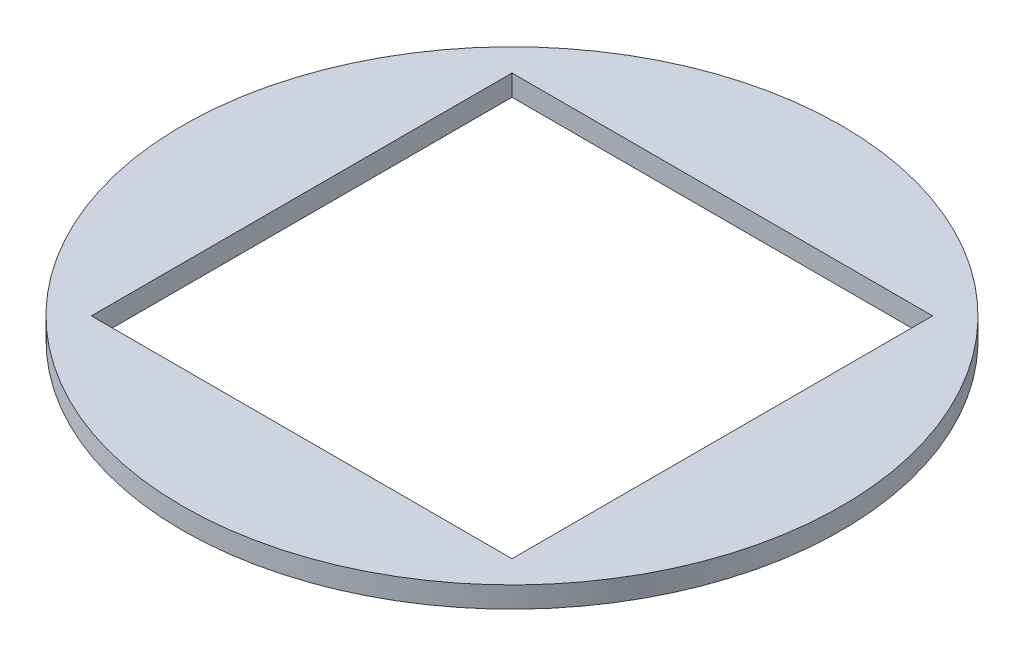
ISO-10303-21;
HEADER;
FILE_DESCRIPTION(('STEP AP214'),'2;1');
FILE_NAME('part.step','',(''),(''),'','','');
FILE_SCHEMA(('AUTOMOTIVE_DESIGN { 1 0 10303 214 1 1 1 1 }'));
ENDSEC;
DATA;
#1=APPLICATION_CONTEXT('core data for automotive mechanical design processes');
#2=APPLICATION_PROTOCOL_DEFINITION('international standard','automotive_design',2000,#1);
#3=PRODUCT_CONTEXT('',#1,'mechanical');
#4=PRODUCT('Part','Part','',(#3));
#5=PRODUCT_RELATED_PRODUCT_CATEGORY('part','',(#4));
#6=PRODUCT_DEFINITION_FORMATION('','',#4);
#7=PRODUCT_DEFINITION_CONTEXT('part definition',#1,'design');
#8=PRODUCT_DEFINITION('design','',#6,#7);
#9=PRODUCT_DEFINITION_SHAPE('','',#8);
#10=(LENGTH_UNIT() NAMED_UNIT(*) SI_UNIT(.MILLI.,.METRE.));
#11=(NAMED_UNIT(*) PLANE_ANGLE_UNIT() SI_UNIT($,.RADIAN.));
#12=(NAMED_UNIT(*) SI_UNIT($,.STERADIAN.) SOLID_ANGLE_UNIT());
#13=UNCERTAINTY_MEASURE_WITH_UNIT(LENGTH_MEASURE(1.E-05),#10,'distance_accuracy_value','');
#14=(GEOMETRIC_REPRESENTATION_CONTEXT(3) GLOBAL_UNCERTAINTY_ASSIGNED_CONTEXT((#13)) GLOBAL_UNIT_ASSIGNED_CONTEXT((#10,
#11,#12)) REPRESENTATION_CONTEXT('',''));
#15=CARTESIAN_POINT('',(0.,0.,0.));
#16=DIRECTION('',(0.,0.,1.));
#17=DIRECTION('',(1.,0.,0.));
#18=AXIS2_PLACEMENT_3D('',#15,#16,#17);
#19=CARTESIAN_POINT('',(0.,5.,0.));
#20=DIRECTION('',(0.,-1.,0.));
#21=DIRECTION('',(0.,0.,-1.));
#22=AXIS2_PLACEMENT_3D('',#19,#20,#21);
#23=CYLINDRICAL_SURFACE('',#22,78.35);
#24=CARTESIAN_POINT('',(0.,5.,0.));
#25=DIRECTION('',(0.,1.,0.));
#26=DIRECTION('',(0.,0.,1.));
#27=AXIS2_PLACEMENT_3D('',#24,#25,#26);
#28=CIRCLE('',#27,78.35);
#29=CARTESIAN_POINT('',(0.,5.,78.35));
#30=VERTEX_POINT('',#29);
#31=EDGE_CURVE('E12',#30,#30,#28,.T.);
#32=ORIENTED_EDGE('',*,*,#31,.F.);
#33=EDGE_LOOP('',(#32));
#34=FACE_BOUND('',#33,.T.);
#35=CARTESIAN_POINT('',(0.,0.,0.));
#36=DIRECTION('',(0.,1.,0.));
#37=DIRECTION('',(0.,0.,1.));
#38=AXIS2_PLACEMENT_3D('',#35,#36,#37);
#39=CIRCLE('',#38,78.35);
#40=CARTESIAN_POINT('',(0.,0.,78.35));
#41=VERTEX_POINT('',#40);
#42=EDGE_CURVE('E57',#41,#41,#39,.T.);
#43=ORIENTED_EDGE('',*,*,#42,.T.);
#44=EDGE_LOOP('',(#43));
#45=FACE_BOUND('',#44,.T.);
#46=ADVANCED_FACE('F54',(#34,#45),#23,.T.);
#47=CARTESIAN_POINT('',(0.,5.,0.));
#48=DIRECTION('',(0.,1.,0.));
#49=DIRECTION('',(0.,0.,1.));
#50=AXIS2_PLACEMENT_3D('',#47,#48,#49);
#51=PLANE('',#50);
#52=DIRECTION('',(1.,0.,0.));
#53=VECTOR('',#52,1.);
#54=CARTESIAN_POINT('',(-50.,5.,-50.));
#55=LINE('',#54,#53);
#56=CARTESIAN_POINT('',(-50.,5.,-50.));
#57=VERTEX_POINT('',#56);
#58=CARTESIAN_POINT('',(50.,5.,-50.));
#59=VERTEX_POINT('',#58);
#60=EDGE_CURVE('E103',#57,#59,#55,.T.);
#61=ORIENTED_EDGE('',*,*,#60,.T.);
#62=DIRECTION('',(0.,0.,-1.));
#63=VECTOR('',#62,1.);
#64=CARTESIAN_POINT('',(50.,5.,50.));
#65=LINE('',#64,#63);
#66=CARTESIAN_POINT('',(50.,5.,50.));
#67=VERTEX_POINT('',#66);
#68=EDGE_CURVE('E94',#67,#59,#65,.T.);
#69=ORIENTED_EDGE('',*,*,#68,.F.);
#70=DIRECTION('',(1.,0.,0.));
#71=VECTOR('',#70,1.);
#72=CARTESIAN_POINT('',(-50.,5.,50.));
#73=LINE('',#72,#71);
#74=CARTESIAN_POINT('',(-50.,5.,50.));
#75=VERTEX_POINT('',#74);
#76=EDGE_CURVE('E102',#75,#67,#73,.T.);
#77=ORIENTED_EDGE('',*,*,#76,.F.);
#78=DIRECTION('',(0.,0.,-1.));
#79=VECTOR('',#78,1.);
#80=CARTESIAN_POINT('',(-50.,5.,50.));
#81=LINE('',#80,#79);
#82=EDGE_CURVE('E109',#75,#57,#81,.T.);
#83=ORIENTED_EDGE('',*,*,#82,.T.);
#84=EDGE_LOOP('',(#61,#69,#77,#83));
#85=FACE_BOUND('',#84,.T.);
#86=ORIENTED_EDGE('',*,*,#31,.T.);
#87=EDGE_LOOP('',(#86));
#88=FACE_BOUND('',#87,.T.);
#89=ADVANCED_FACE('F111',(#85,#88),#51,.T.);
#90=CARTESIAN_POINT('',(0.,0.,0.));
#91=DIRECTION('',(0.,1.,0.));
#92=DIRECTION('',(0.,0.,1.));
#93=AXIS2_PLACEMENT_3D('',#90,#91,#92);
#94=PLANE('',#93);
#95=DIRECTION('',(0.,0.,-1.));
#96=VECTOR('',#95,1.);
#97=CARTESIAN_POINT('',(50.,0.,50.));
#98=LINE('',#97,#96);
#99=CARTESIAN_POINT('',(50.,0.,50.));
#100=VERTEX_POINT('',#99);
#101=CARTESIAN_POINT('',(50.,0.,-50.));
#102=VERTEX_POINT('',#101);
#103=EDGE_CURVE('E128',#100,#102,#98,.T.);
#104=ORIENTED_EDGE('',*,*,#103,.T.);
#105=DIRECTION('',(1.,0.,0.));
#106=VECTOR('',#105,1.);
#107=CARTESIAN_POINT('',(-50.,0.,-50.));
#108=LINE('',#107,#106);
#109=CARTESIAN_POINT('',(-50.,0.,-50.));
#110=VERTEX_POINT('',#109);
#111=EDGE_CURVE('E77',#110,#102,#108,.T.);
#112=ORIENTED_EDGE('',*,*,#111,.F.);
#113=DIRECTION('',(0.,0.,-1.));
#114=VECTOR('',#113,1.);
#115=CARTESIAN_POINT('',(-50.,0.,50.));
#116=LINE('',#115,#114);
#117=CARTESIAN_POINT('',(-50.,0.,50.));
#118=VERTEX_POINT('',#117);
#119=EDGE_CURVE('E115',#118,#110,#116,.T.);
#120=ORIENTED_EDGE('',*,*,#119,.F.);
#121=DIRECTION('',(1.,0.,0.));
#122=VECTOR('',#121,1.);
#123=CARTESIAN_POINT('',(-50.,0.,50.));
#124=LINE('',#123,#122);
#125=EDGE_CURVE('E119',#118,#100,#124,.T.);
#126=ORIENTED_EDGE('',*,*,#125,.T.);
#127=EDGE_LOOP('',(#104,#112,#120,#126));
#128=FACE_BOUND('',#127,.T.);
#129=ORIENTED_EDGE('',*,*,#42,.F.);
#130=EDGE_LOOP('',(#129));
#131=FACE_BOUND('',#130,.T.);
#132=ADVANCED_FACE('F146',(#128,#131),#94,.F.);
#133=CARTESIAN_POINT('',(-50.,5.,-50.));
#134=DIRECTION('',(0.,0.,-1.));
#135=DIRECTION('',(-1.,0.,0.));
#136=AXIS2_PLACEMENT_3D('',#133,#134,#135);
#137=PLANE('',#136);
#138=ORIENTED_EDGE('',*,*,#111,.T.);
#139=DIRECTION('',(0.,-1.,0.));
#140=VECTOR('',#139,1.);
#141=CARTESIAN_POINT('',(50.,5.,-50.));
#142=LINE('',#141,#140);
#143=EDGE_CURVE('E96',#59,#102,#142,.T.);
#144=ORIENTED_EDGE('',*,*,#143,.F.);
#145=ORIENTED_EDGE('',*,*,#60,.F.);
#146=DIRECTION('',(0.,-1.,0.));
#147=VECTOR('',#146,1.);
#148=CARTESIAN_POINT('',(-50.,5.,-50.));
#149=LINE('',#148,#147);
#150=EDGE_CURVE('E134',#57,#110,#149,.T.);
#151=ORIENTED_EDGE('',*,*,#150,.T.);
#152=EDGE_LOOP('',(#138,#144,#145,#151));
#153=FACE_BOUND('',#152,.T.);
#154=ADVANCED_FACE('F106',(#153),#137,.F.);
#155=CARTESIAN_POINT('',(-50.,5.,50.));
#156=DIRECTION('',(-1.,0.,0.));
#157=DIRECTION('',(0.,0.,1.));
#158=AXIS2_PLACEMENT_3D('',#155,#156,#157);
#159=PLANE('',#158);
#160=ORIENTED_EDGE('',*,*,#119,.T.);
#161=ORIENTED_EDGE('',*,*,#150,.F.);
#162=ORIENTED_EDGE('',*,*,#82,.F.);
#163=DIRECTION('',(0.,-1.,0.));
#164=VECTOR('',#163,1.);
#165=CARTESIAN_POINT('',(-50.,5.,50.));
#166=LINE('',#165,#164);
#167=EDGE_CURVE('E137',#75,#118,#166,.T.);
#168=ORIENTED_EDGE('',*,*,#167,.T.);
#169=EDGE_LOOP('',(#160,#161,#162,#168));
#170=FACE_BOUND('',#169,.T.);
#171=ADVANCED_FACE('F149',(#170),#159,.F.);
#172=CARTESIAN_POINT('',(-50.,5.,50.));
#173=DIRECTION('',(0.,0.,-1.));
#174=DIRECTION('',(-1.,0.,0.));
#175=AXIS2_PLACEMENT_3D('',#172,#173,#174);
#176=PLANE('',#175);
#177=ORIENTED_EDGE('',*,*,#125,.F.);
#178=ORIENTED_EDGE('',*,*,#167,.F.);
#179=ORIENTED_EDGE('',*,*,#76,.T.);
#180=DIRECTION('',(0.,-1.,0.));
#181=VECTOR('',#180,1.);
#182=CARTESIAN_POINT('',(50.,5.,50.));
#183=LINE('',#182,#181);
#184=EDGE_CURVE('E69',#67,#100,#183,.T.);
#185=ORIENTED_EDGE('',*,*,#184,.T.);
#186=EDGE_LOOP('',(#177,#178,#179,#185));
#187=FACE_BOUND('',#186,.T.);
#188=ADVANCED_FACE('F143',(#187),#176,.T.);
#189=CARTESIAN_POINT('',(50.,5.,50.));
#190=DIRECTION('',(-1.,0.,0.));
#191=DIRECTION('',(0.,0.,1.));
#192=AXIS2_PLACEMENT_3D('',#189,#190,#191);
#193=PLANE('',#192);
#194=ORIENTED_EDGE('',*,*,#103,.F.);
#195=ORIENTED_EDGE('',*,*,#184,.F.);
#196=ORIENTED_EDGE('',*,*,#68,.T.);
#197=ORIENTED_EDGE('',*,*,#143,.T.);
#198=EDGE_LOOP('',(#194,#195,#196,#197));
#199=FACE_BOUND('',#198,.T.);
#200=ADVANCED_FACE('F95',(#199),#193,.T.);
#201=CLOSED_SHELL('',(#46,#89,#132,#154,#171,#188,#200));
#202=MANIFOLD_SOLID_BREP('B2',#201);
#203=ADVANCED_BREP_SHAPE_REPRESENTATION('',(#18,#202),#14);
#204=SHAPE_DEFINITION_REPRESENTATION(#9,#203);
ENDSEC;
END-ISO-10303-21;
